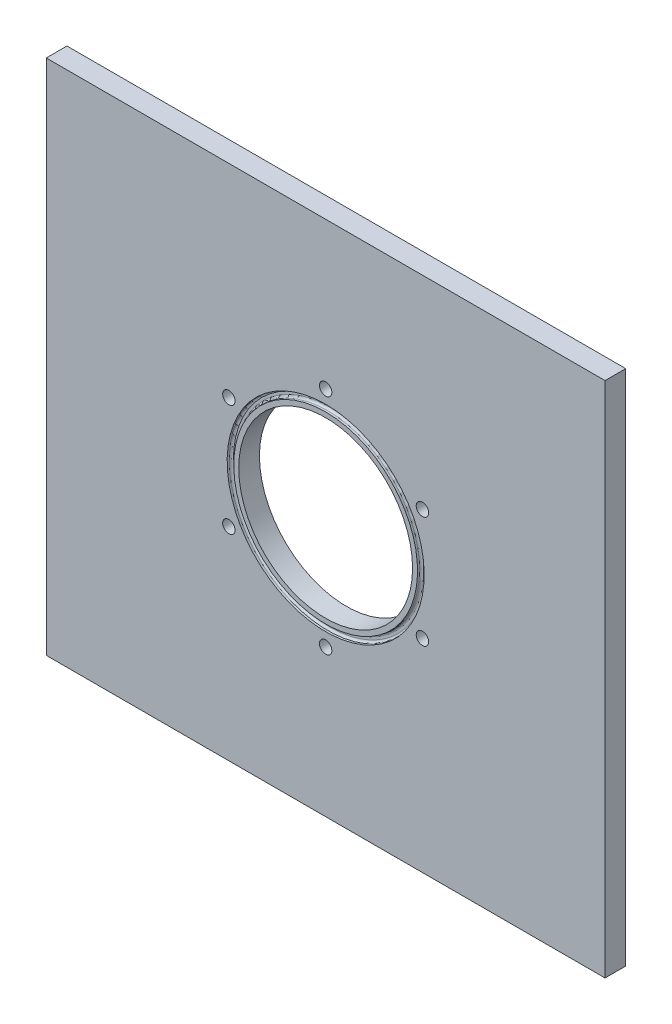
ISO-10303-21;
HEADER;
FILE_DESCRIPTION(('STEP AP214'),'2;1');
FILE_NAME('part.step','',(''),(''),'','','');
FILE_SCHEMA(('AUTOMOTIVE_DESIGN { 1 0 10303 214 1 1 1 1 }'));
ENDSEC;
DATA;
#1=APPLICATION_CONTEXT('core data for automotive mechanical design processes');
#2=APPLICATION_PROTOCOL_DEFINITION('international standard','automotive_design',2000,#1);
#3=PRODUCT_CONTEXT('',#1,'mechanical');
#4=PRODUCT('Part','Part','',(#3));
#5=PRODUCT_RELATED_PRODUCT_CATEGORY('part','',(#4));
#6=PRODUCT_DEFINITION_FORMATION('','',#4);
#7=PRODUCT_DEFINITION_CONTEXT('part definition',#1,'design');
#8=PRODUCT_DEFINITION('design','',#6,#7);
#9=PRODUCT_DEFINITION_SHAPE('','',#8);
#10=(LENGTH_UNIT() NAMED_UNIT(*) SI_UNIT(.MILLI.,.METRE.));
#11=(NAMED_UNIT(*) PLANE_ANGLE_UNIT() SI_UNIT($,.RADIAN.));
#12=(NAMED_UNIT(*) SI_UNIT($,.STERADIAN.) SOLID_ANGLE_UNIT());
#13=UNCERTAINTY_MEASURE_WITH_UNIT(LENGTH_MEASURE(1.E-05),#10,'distance_accuracy_value','');
#14=(GEOMETRIC_REPRESENTATION_CONTEXT(3) GLOBAL_UNCERTAINTY_ASSIGNED_CONTEXT((#13)) GLOBAL_UNIT_ASSIGNED_CONTEXT((#10,
#11,#12)) REPRESENTATION_CONTEXT('',''));
#15=CARTESIAN_POINT('',(0.,0.,0.));
#16=DIRECTION('',(0.,0.,1.));
#17=DIRECTION('',(1.,0.,0.));
#18=AXIS2_PLACEMENT_3D('',#15,#16,#17);
#19=CARTESIAN_POINT('',(0.,0.,5.));
#20=DIRECTION('',(0.,0.,1.));
#21=DIRECTION('',(1.,0.,0.));
#22=AXIS2_PLACEMENT_3D('',#19,#20,#21);
#23=PLANE('',#22);
#24=DIRECTION('',(1.,0.,0.));
#25=VECTOR('',#24,1.);
#26=CARTESIAN_POINT('',(0.,-62.5,5.));
#27=LINE('',#26,#25);
#28=CARTESIAN_POINT('',(-67.5,-62.5,5.));
#29=VERTEX_POINT('',#28);
#30=CARTESIAN_POINT('',(67.5,-62.5,5.));
#31=VERTEX_POINT('',#30);
#32=EDGE_CURVE('E176',#29,#31,#27,.T.);
#33=ORIENTED_EDGE('',*,*,#32,.T.);
#34=DIRECTION('',(0.,1.,0.));
#35=VECTOR('',#34,1.);
#36=CARTESIAN_POINT('',(67.5,0.,5.));
#37=LINE('',#36,#35);
#38=CARTESIAN_POINT('',(67.5,62.5,5.));
#39=VERTEX_POINT('',#38);
#40=EDGE_CURVE('E168',#31,#39,#37,.T.);
#41=ORIENTED_EDGE('',*,*,#40,.T.);
#42=DIRECTION('',(1.,0.,0.));
#43=VECTOR('',#42,1.);
#44=CARTESIAN_POINT('',(0.,62.5,5.));
#45=LINE('',#44,#43);
#46=CARTESIAN_POINT('',(-67.5,62.5,5.));
#47=VERTEX_POINT('',#46);
#48=EDGE_CURVE('E175',#47,#39,#45,.T.);
#49=ORIENTED_EDGE('',*,*,#48,.F.);
#50=DIRECTION('',(0.,1.,0.));
#51=VECTOR('',#50,1.);
#52=CARTESIAN_POINT('',(-67.5,0.,5.));
#53=LINE('',#52,#51);
#54=EDGE_CURVE('E188',#29,#47,#53,.T.);
#55=ORIENTED_EDGE('',*,*,#54,.F.);
#56=EDGE_LOOP('',(#33,#41,#49,#55));
#57=FACE_BOUND('',#56,.T.);
#58=CARTESIAN_POINT('',(-23.3826859021798,-13.5,5.));
#59=DIRECTION('',(0.,0.,1.));
#60=DIRECTION('',(1.,0.,0.));
#61=AXIS2_PLACEMENT_3D('',#58,#59,#60);
#62=CIRCLE('',#61,1.50000000000024);
#63=CARTESIAN_POINT('',(-21.8826859021796,-13.5,5.));
#64=VERTEX_POINT('',#63);
#65=EDGE_CURVE('E232',#64,#64,#62,.T.);
#66=ORIENTED_EDGE('',*,*,#65,.F.);
#67=EDGE_LOOP('',(#66));
#68=FACE_BOUND('',#67,.T.);
#69=CARTESIAN_POINT('',(-23.3826859021799,13.5,5.));
#70=DIRECTION('',(0.,0.,1.));
#71=DIRECTION('',(1.,0.,0.));
#72=AXIS2_PLACEMENT_3D('',#69,#70,#71);
#73=CIRCLE('',#72,1.50000000000032);
#74=CARTESIAN_POINT('',(-21.8826859021795,13.5,5.));
#75=VERTEX_POINT('',#74);
#76=EDGE_CURVE('E236',#75,#75,#73,.T.);
#77=ORIENTED_EDGE('',*,*,#76,.F.);
#78=EDGE_LOOP('',(#77));
#79=FACE_BOUND('',#78,.T.);
#80=CARTESIAN_POINT('',(0.,27.,5.));
#81=DIRECTION('',(0.,0.,1.));
#82=DIRECTION('',(1.,0.,0.));
#83=AXIS2_PLACEMENT_3D('',#80,#81,#82);
#84=CIRCLE('',#83,1.5);
#85=CARTESIAN_POINT('',(1.5,27.,5.));
#86=VERTEX_POINT('',#85);
#87=EDGE_CURVE('E269',#86,#86,#84,.T.);
#88=ORIENTED_EDGE('',*,*,#87,.F.);
#89=EDGE_LOOP('',(#88));
#90=FACE_BOUND('',#89,.T.);
#91=CARTESIAN_POINT('',(23.3826859021798,13.5,5.));
#92=DIRECTION('',(0.,0.,1.));
#93=DIRECTION('',(1.,0.,0.));
#94=AXIS2_PLACEMENT_3D('',#91,#92,#93);
#95=CIRCLE('',#94,1.50000000000008);
#96=CARTESIAN_POINT('',(24.8826859021799,13.5,5.));
#97=VERTEX_POINT('',#96);
#98=EDGE_CURVE('E261',#97,#97,#95,.T.);
#99=ORIENTED_EDGE('',*,*,#98,.F.);
#100=EDGE_LOOP('',(#99));
#101=FACE_BOUND('',#100,.T.);
#102=CARTESIAN_POINT('',(23.3826859021798,-13.5,5.));
#103=DIRECTION('',(0.,0.,1.));
#104=DIRECTION('',(1.,0.,0.));
#105=AXIS2_PLACEMENT_3D('',#102,#103,#104);
#106=CIRCLE('',#105,1.50000000000013);
#107=CARTESIAN_POINT('',(24.88268590218,-13.5,5.));
#108=VERTEX_POINT('',#107);
#109=EDGE_CURVE('E253',#108,#108,#106,.T.);
#110=ORIENTED_EDGE('',*,*,#109,.F.);
#111=EDGE_LOOP('',(#110));
#112=FACE_BOUND('',#111,.T.);
#113=CARTESIAN_POINT('',(0.,-27.,5.));
#114=DIRECTION('',(0.,0.,1.));
#115=DIRECTION('',(1.,0.,0.));
#116=AXIS2_PLACEMENT_3D('',#113,#114,#115);
#117=CIRCLE('',#116,1.50000000000018);
#118=CARTESIAN_POINT('',(1.50000000000019,-27.,5.));
#119=VERTEX_POINT('',#118);
#120=EDGE_CURVE('E244',#119,#119,#117,.T.);
#121=ORIENTED_EDGE('',*,*,#120,.F.);
#122=EDGE_LOOP('',(#121));
#123=FACE_BOUND('',#122,.T.);
#124=CARTESIAN_POINT('',(0.,0.,5.));
#125=DIRECTION('',(0.,0.,-1.));
#126=DIRECTION('',(0.,1.,0.));
#127=AXIS2_PLACEMENT_3D('',#124,#125,#126);
#128=CIRCLE('',#127,23.8);
#129=CARTESIAN_POINT('',(0.,23.8,5.));
#130=VERTEX_POINT('',#129);
#131=EDGE_CURVE('E284',#130,#130,#128,.T.);
#132=ORIENTED_EDGE('',*,*,#131,.T.);
#133=EDGE_LOOP('',(#132));
#134=FACE_BOUND('',#133,.T.);
#135=ADVANCED_FACE('F125',(#57,#68,#79,#90,#101,#112,#123,#134),#23,.T.);
#136=CARTESIAN_POINT('',(0.,0.,5.));
#137=DIRECTION('',(0.,0.,1.));
#138=DIRECTION('',(1.,0.,0.));
#139=AXIS2_PLACEMENT_3D('',#136,#137,#138);
#140=CIRCLE('',#139,21.);
#141=CARTESIAN_POINT('',(21.,0.,5.));
#142=VERTEX_POINT('',#141);
#143=EDGE_CURVE('E212',#142,#142,#140,.T.);
#144=ORIENTED_EDGE('',*,*,#143,.F.);
#145=EDGE_LOOP('',(#144));
#146=FACE_BOUND('',#145,.T.);
#147=CARTESIAN_POINT('',(0.,0.,5.));
#148=DIRECTION('',(0.,0.,-1.));
#149=DIRECTION('',(0.,1.,0.));
#150=AXIS2_PLACEMENT_3D('',#147,#148,#149);
#151=CIRCLE('',#150,22.2);
#152=CARTESIAN_POINT('',(0.,22.2,5.));
#153=VERTEX_POINT('',#152);
#154=EDGE_CURVE('E314',#153,#153,#151,.T.);
#155=ORIENTED_EDGE('',*,*,#154,.F.);
#156=EDGE_LOOP('',(#155));
#157=FACE_BOUND('',#156,.T.);
#158=ADVANCED_FACE('F322',(#146,#157),#23,.T.);
#159=CARTESIAN_POINT('',(67.5,0.,5.));
#160=DIRECTION('',(-1.,0.,0.));
#161=DIRECTION('',(0.,0.,1.));
#162=AXIS2_PLACEMENT_3D('',#159,#160,#161);
#163=PLANE('',#162);
#164=DIRECTION('',(0.,1.,0.));
#165=VECTOR('',#164,1.);
#166=CARTESIAN_POINT('',(67.5,0.,0.));
#167=LINE('',#166,#165);
#168=CARTESIAN_POINT('',(67.5,-62.5,0.));
#169=VERTEX_POINT('',#168);
#170=CARTESIAN_POINT('',(67.5,62.5,0.));
#171=VERTEX_POINT('',#170);
#172=EDGE_CURVE('E182',#169,#171,#167,.T.);
#173=ORIENTED_EDGE('',*,*,#172,.T.);
#174=DIRECTION('',(0.,0.,-1.));
#175=VECTOR('',#174,1.);
#176=CARTESIAN_POINT('',(67.5,62.5,5.));
#177=LINE('',#176,#175);
#178=EDGE_CURVE('E135',#39,#171,#177,.T.);
#179=ORIENTED_EDGE('',*,*,#178,.F.);
#180=ORIENTED_EDGE('',*,*,#40,.F.);
#181=DIRECTION('',(0.,0.,-1.));
#182=VECTOR('',#181,1.);
#183=CARTESIAN_POINT('',(67.5,-62.5,5.));
#184=LINE('',#183,#182);
#185=EDGE_CURVE('E12',#31,#169,#184,.T.);
#186=ORIENTED_EDGE('',*,*,#185,.T.);
#187=EDGE_LOOP('',(#173,#179,#180,#186));
#188=FACE_BOUND('',#187,.T.);
#189=ADVANCED_FACE('F181',(#188),#163,.F.);
#190=CARTESIAN_POINT('',(0.,62.5,5.));
#191=DIRECTION('',(0.,1.,0.));
#192=DIRECTION('',(0.,0.,1.));
#193=AXIS2_PLACEMENT_3D('',#190,#191,#192);
#194=PLANE('',#193);
#195=DIRECTION('',(1.,0.,0.));
#196=VECTOR('',#195,1.);
#197=CARTESIAN_POINT('',(0.,62.5,0.));
#198=LINE('',#197,#196);
#199=CARTESIAN_POINT('',(-67.5,62.5,0.));
#200=VERTEX_POINT('',#199);
#201=EDGE_CURVE('E205',#200,#171,#198,.T.);
#202=ORIENTED_EDGE('',*,*,#201,.F.);
#203=DIRECTION('',(0.,0.,-1.));
#204=VECTOR('',#203,1.);
#205=CARTESIAN_POINT('',(-67.5,62.5,5.));
#206=LINE('',#205,#204);
#207=EDGE_CURVE('E157',#47,#200,#206,.T.);
#208=ORIENTED_EDGE('',*,*,#207,.F.);
#209=ORIENTED_EDGE('',*,*,#48,.T.);
#210=ORIENTED_EDGE('',*,*,#178,.T.);
#211=EDGE_LOOP('',(#202,#208,#209,#210));
#212=FACE_BOUND('',#211,.T.);
#213=ADVANCED_FACE('F186',(#212),#194,.T.);
#214=CARTESIAN_POINT('',(-67.5,0.,5.));
#215=DIRECTION('',(-1.,0.,0.));
#216=DIRECTION('',(0.,0.,1.));
#217=AXIS2_PLACEMENT_3D('',#214,#215,#216);
#218=PLANE('',#217);
#219=DIRECTION('',(0.,1.,0.));
#220=VECTOR('',#219,1.);
#221=CARTESIAN_POINT('',(-67.5,0.,0.));
#222=LINE('',#221,#220);
#223=CARTESIAN_POINT('',(-67.5,-62.5,0.));
#224=VERTEX_POINT('',#223);
#225=EDGE_CURVE('E208',#224,#200,#222,.T.);
#226=ORIENTED_EDGE('',*,*,#225,.F.);
#227=DIRECTION('',(0.,0.,-1.));
#228=VECTOR('',#227,1.);
#229=CARTESIAN_POINT('',(-67.5,-62.5,5.));
#230=LINE('',#229,#228);
#231=EDGE_CURVE('E143',#29,#224,#230,.T.);
#232=ORIENTED_EDGE('',*,*,#231,.F.);
#233=ORIENTED_EDGE('',*,*,#54,.T.);
#234=ORIENTED_EDGE('',*,*,#207,.T.);
#235=EDGE_LOOP('',(#226,#232,#233,#234));
#236=FACE_BOUND('',#235,.T.);
#237=ADVANCED_FACE('F340',(#236),#218,.T.);
#238=CARTESIAN_POINT('',(0.,-62.5,5.));
#239=DIRECTION('',(0.,1.,0.));
#240=DIRECTION('',(0.,0.,1.));
#241=AXIS2_PLACEMENT_3D('',#238,#239,#240);
#242=PLANE('',#241);
#243=DIRECTION('',(1.,0.,0.));
#244=VECTOR('',#243,1.);
#245=CARTESIAN_POINT('',(0.,-62.5,0.));
#246=LINE('',#245,#244);
#247=EDGE_CURVE('E199',#224,#169,#246,.T.);
#248=ORIENTED_EDGE('',*,*,#247,.T.);
#249=ORIENTED_EDGE('',*,*,#185,.F.);
#250=ORIENTED_EDGE('',*,*,#32,.F.);
#251=ORIENTED_EDGE('',*,*,#231,.T.);
#252=EDGE_LOOP('',(#248,#249,#250,#251));
#253=FACE_BOUND('',#252,.T.);
#254=ADVANCED_FACE('F343',(#253),#242,.F.);
#255=CARTESIAN_POINT('',(0.,0.,5.));
#256=DIRECTION('',(0.,0.,-1.));
#257=DIRECTION('',(-1.,0.,0.));
#258=AXIS2_PLACEMENT_3D('',#255,#256,#257);
#259=CYLINDRICAL_SURFACE('',#258,21.);
#260=ORIENTED_EDGE('',*,*,#143,.T.);
#261=EDGE_LOOP('',(#260));
#262=FACE_BOUND('',#261,.T.);
#263=CARTESIAN_POINT('',(0.,0.,0.));
#264=DIRECTION('',(0.,0.,1.));
#265=DIRECTION('',(1.,0.,0.));
#266=AXIS2_PLACEMENT_3D('',#263,#264,#265);
#267=CIRCLE('',#266,21.);
#268=CARTESIAN_POINT('',(21.,0.,0.));
#269=VERTEX_POINT('',#268);
#270=EDGE_CURVE('E195',#269,#269,#267,.T.);
#271=ORIENTED_EDGE('',*,*,#270,.F.);
#272=EDGE_LOOP('',(#271));
#273=FACE_BOUND('',#272,.T.);
#274=ADVANCED_FACE('F127',(#262,#273),#259,.F.);
#275=CARTESIAN_POINT('',(0.,0.,0.));
#276=DIRECTION('',(0.,0.,1.));
#277=DIRECTION('',(1.,0.,0.));
#278=AXIS2_PLACEMENT_3D('',#275,#276,#277);
#279=PLANE('',#278);
#280=CARTESIAN_POINT('',(-27.,0.,0.));
#281=DIRECTION('',(0.,0.,-1.));
#282=DIRECTION('',(-1.,0.,0.));
#283=AXIS2_PLACEMENT_3D('',#280,#281,#282);
#284=CIRCLE('',#283,1.5);
#285=CARTESIAN_POINT('',(-28.5,0.,0.));
#286=VERTEX_POINT('',#285);
#287=EDGE_CURVE('E288',#286,#286,#284,.T.);
#288=ORIENTED_EDGE('',*,*,#287,.F.);
#289=EDGE_LOOP('',(#288));
#290=FACE_BOUND('',#289,.T.);
#291=CARTESIAN_POINT('',(27.,0.,0.));
#292=DIRECTION('',(0.,0.,-1.));
#293=DIRECTION('',(-1.,0.,0.));
#294=AXIS2_PLACEMENT_3D('',#291,#292,#293);
#295=CIRCLE('',#294,1.5);
#296=CARTESIAN_POINT('',(25.5,0.,0.));
#297=VERTEX_POINT('',#296);
#298=EDGE_CURVE('E283',#297,#297,#295,.T.);
#299=ORIENTED_EDGE('',*,*,#298,.F.);
#300=EDGE_LOOP('',(#299));
#301=FACE_BOUND('',#300,.T.);
#302=ORIENTED_EDGE('',*,*,#270,.T.);
#303=EDGE_LOOP('',(#302));
#304=FACE_BOUND('',#303,.T.);
#305=ORIENTED_EDGE('',*,*,#247,.F.);
#306=ORIENTED_EDGE('',*,*,#225,.T.);
#307=ORIENTED_EDGE('',*,*,#201,.T.);
#308=ORIENTED_EDGE('',*,*,#172,.F.);
#309=EDGE_LOOP('',(#305,#306,#307,#308));
#310=FACE_BOUND('',#309,.T.);
#311=ADVANCED_FACE('F336',(#290,#301,#304,#310),#279,.F.);
#312=CARTESIAN_POINT('',(-23.3826859021798,-13.5,2.));
#313=DIRECTION('',(0.,0.,1.));
#314=DIRECTION('',(1.,0.,0.));
#315=AXIS2_PLACEMENT_3D('',#312,#313,#314);
#316=CYLINDRICAL_SURFACE('',#315,1.50000000000024);
#317=CARTESIAN_POINT('',(-23.3826859021798,-13.5,2.));
#318=DIRECTION('',(0.,0.,1.));
#319=DIRECTION('',(1.,0.,0.));
#320=AXIS2_PLACEMENT_3D('',#317,#318,#319);
#321=CIRCLE('',#320,1.50000000000024);
#322=CARTESIAN_POINT('',(-21.8826859021796,-13.5,2.));
#323=VERTEX_POINT('',#322);
#324=EDGE_CURVE('E200',#323,#323,#321,.T.);
#325=ORIENTED_EDGE('',*,*,#324,.F.);
#326=EDGE_LOOP('',(#325));
#327=FACE_BOUND('',#326,.T.);
#328=ORIENTED_EDGE('',*,*,#65,.T.);
#329=EDGE_LOOP('',(#328));
#330=FACE_BOUND('',#329,.T.);
#331=ADVANCED_FACE('F334',(#327,#330),#316,.F.);
#332=CARTESIAN_POINT('',(-23.3826859021798,-13.5,2.));
#333=DIRECTION('',(0.,0.,1.));
#334=DIRECTION('',(1.,0.,0.));
#335=AXIS2_PLACEMENT_3D('',#332,#333,#334);
#336=PLANE('',#335);
#337=ORIENTED_EDGE('',*,*,#324,.T.);
#338=EDGE_LOOP('',(#337));
#339=FACE_BOUND('',#338,.T.);
#340=ADVANCED_FACE('F408',(#339),#336,.T.);
#341=CARTESIAN_POINT('',(-23.3826859021799,13.5,2.));
#342=DIRECTION('',(0.,0.,1.));
#343=DIRECTION('',(1.,0.,0.));
#344=AXIS2_PLACEMENT_3D('',#341,#342,#343);
#345=CYLINDRICAL_SURFACE('',#344,1.50000000000032);
#346=CARTESIAN_POINT('',(-23.3826859021799,13.5,2.));
#347=DIRECTION('',(0.,0.,1.));
#348=DIRECTION('',(1.,0.,0.));
#349=AXIS2_PLACEMENT_3D('',#346,#347,#348);
#350=CIRCLE('',#349,1.50000000000032);
#351=CARTESIAN_POINT('',(-21.8826859021795,13.5,2.));
#352=VERTEX_POINT('',#351);
#353=EDGE_CURVE('E273',#352,#352,#350,.T.);
#354=ORIENTED_EDGE('',*,*,#353,.F.);
#355=EDGE_LOOP('',(#354));
#356=FACE_BOUND('',#355,.T.);
#357=ORIENTED_EDGE('',*,*,#76,.T.);
#358=EDGE_LOOP('',(#357));
#359=FACE_BOUND('',#358,.T.);
#360=ADVANCED_FACE('F418',(#356,#359),#345,.F.);
#361=CARTESIAN_POINT('',(-23.3826859021799,13.5,2.));
#362=DIRECTION('',(0.,0.,1.));
#363=DIRECTION('',(1.,0.,0.));
#364=AXIS2_PLACEMENT_3D('',#361,#362,#363);
#365=PLANE('',#364);
#366=ORIENTED_EDGE('',*,*,#353,.T.);
#367=EDGE_LOOP('',(#366));
#368=FACE_BOUND('',#367,.T.);
#369=ADVANCED_FACE('F428',(#368),#365,.T.);
#370=CARTESIAN_POINT('',(0.,27.,2.));
#371=DIRECTION('',(0.,0.,1.));
#372=DIRECTION('',(1.,0.,0.));
#373=AXIS2_PLACEMENT_3D('',#370,#371,#372);
#374=CYLINDRICAL_SURFACE('',#373,1.5);
#375=CARTESIAN_POINT('',(0.,27.,2.));
#376=DIRECTION('',(0.,0.,1.));
#377=DIRECTION('',(1.,0.,0.));
#378=AXIS2_PLACEMENT_3D('',#375,#376,#377);
#379=CIRCLE('',#378,1.5);
#380=CARTESIAN_POINT('',(1.5,27.,2.));
#381=VERTEX_POINT('',#380);
#382=EDGE_CURVE('E265',#381,#381,#379,.T.);
#383=ORIENTED_EDGE('',*,*,#382,.F.);
#384=EDGE_LOOP('',(#383));
#385=FACE_BOUND('',#384,.T.);
#386=ORIENTED_EDGE('',*,*,#87,.T.);
#387=EDGE_LOOP('',(#386));
#388=FACE_BOUND('',#387,.T.);
#389=ADVANCED_FACE('F439',(#385,#388),#374,.F.);
#390=CARTESIAN_POINT('',(0.,27.,2.));
#391=DIRECTION('',(0.,0.,1.));
#392=DIRECTION('',(1.,0.,0.));
#393=AXIS2_PLACEMENT_3D('',#390,#391,#392);
#394=PLANE('',#393);
#395=ORIENTED_EDGE('',*,*,#382,.T.);
#396=EDGE_LOOP('',(#395));
#397=FACE_BOUND('',#396,.T.);
#398=ADVANCED_FACE('F450',(#397),#394,.T.);
#399=CARTESIAN_POINT('',(23.3826859021798,13.5,2.));
#400=DIRECTION('',(0.,0.,1.));
#401=DIRECTION('',(1.,0.,0.));
#402=AXIS2_PLACEMENT_3D('',#399,#400,#401);
#403=CYLINDRICAL_SURFACE('',#402,1.50000000000008);
#404=CARTESIAN_POINT('',(23.3826859021798,13.5,2.));
#405=DIRECTION('',(0.,0.,1.));
#406=DIRECTION('',(1.,0.,0.));
#407=AXIS2_PLACEMENT_3D('',#404,#405,#406);
#408=CIRCLE('',#407,1.50000000000008);
#409=CARTESIAN_POINT('',(24.8826859021799,13.5,2.));
#410=VERTEX_POINT('',#409);
#411=EDGE_CURVE('E257',#410,#410,#408,.T.);
#412=ORIENTED_EDGE('',*,*,#411,.F.);
#413=EDGE_LOOP('',(#412));
#414=FACE_BOUND('',#413,.T.);
#415=ORIENTED_EDGE('',*,*,#98,.T.);
#416=EDGE_LOOP('',(#415));
#417=FACE_BOUND('',#416,.T.);
#418=ADVANCED_FACE('F461',(#414,#417),#403,.F.);
#419=CARTESIAN_POINT('',(23.3826859021798,13.5,2.));
#420=DIRECTION('',(0.,0.,1.));
#421=DIRECTION('',(1.,0.,0.));
#422=AXIS2_PLACEMENT_3D('',#419,#420,#421);
#423=PLANE('',#422);
#424=ORIENTED_EDGE('',*,*,#411,.T.);
#425=EDGE_LOOP('',(#424));
#426=FACE_BOUND('',#425,.T.);
#427=ADVANCED_FACE('F472',(#426),#423,.T.);
#428=CARTESIAN_POINT('',(23.3826859021798,-13.5,2.));
#429=DIRECTION('',(0.,0.,1.));
#430=DIRECTION('',(1.,0.,0.));
#431=AXIS2_PLACEMENT_3D('',#428,#429,#430);
#432=CYLINDRICAL_SURFACE('',#431,1.50000000000013);
#433=CARTESIAN_POINT('',(23.3826859021798,-13.5,2.));
#434=DIRECTION('',(0.,0.,1.));
#435=DIRECTION('',(1.,0.,0.));
#436=AXIS2_PLACEMENT_3D('',#433,#434,#435);
#437=CIRCLE('',#436,1.50000000000013);
#438=CARTESIAN_POINT('',(24.88268590218,-13.5,2.));
#439=VERTEX_POINT('',#438);
#440=EDGE_CURVE('E249',#439,#439,#437,.T.);
#441=ORIENTED_EDGE('',*,*,#440,.F.);
#442=EDGE_LOOP('',(#441));
#443=FACE_BOUND('',#442,.T.);
#444=ORIENTED_EDGE('',*,*,#109,.T.);
#445=EDGE_LOOP('',(#444));
#446=FACE_BOUND('',#445,.T.);
#447=ADVANCED_FACE('F483',(#443,#446),#432,.F.);
#448=CARTESIAN_POINT('',(23.3826859021798,-13.5,2.));
#449=DIRECTION('',(0.,0.,1.));
#450=DIRECTION('',(1.,0.,0.));
#451=AXIS2_PLACEMENT_3D('',#448,#449,#450);
#452=PLANE('',#451);
#453=ORIENTED_EDGE('',*,*,#440,.T.);
#454=EDGE_LOOP('',(#453));
#455=FACE_BOUND('',#454,.T.);
#456=ADVANCED_FACE('F494',(#455),#452,.T.);
#457=CARTESIAN_POINT('',(0.,-27.,2.));
#458=DIRECTION('',(0.,0.,1.));
#459=DIRECTION('',(1.,0.,0.));
#460=AXIS2_PLACEMENT_3D('',#457,#458,#459);
#461=CYLINDRICAL_SURFACE('',#460,1.50000000000018);
#462=CARTESIAN_POINT('',(0.,-27.,2.));
#463=DIRECTION('',(0.,0.,1.));
#464=DIRECTION('',(1.,0.,0.));
#465=AXIS2_PLACEMENT_3D('',#462,#463,#464);
#466=CIRCLE('',#465,1.50000000000018);
#467=CARTESIAN_POINT('',(1.50000000000019,-27.,2.));
#468=VERTEX_POINT('',#467);
#469=EDGE_CURVE('E240',#468,#468,#466,.T.);
#470=ORIENTED_EDGE('',*,*,#469,.F.);
#471=EDGE_LOOP('',(#470));
#472=FACE_BOUND('',#471,.T.);
#473=ORIENTED_EDGE('',*,*,#120,.T.);
#474=EDGE_LOOP('',(#473));
#475=FACE_BOUND('',#474,.T.);
#476=ADVANCED_FACE('F505',(#472,#475),#461,.F.);
#477=CARTESIAN_POINT('',(0.,-27.,2.));
#478=DIRECTION('',(0.,0.,1.));
#479=DIRECTION('',(1.,0.,0.));
#480=AXIS2_PLACEMENT_3D('',#477,#478,#479);
#481=PLANE('',#480);
#482=ORIENTED_EDGE('',*,*,#469,.T.);
#483=EDGE_LOOP('',(#482));
#484=FACE_BOUND('',#483,.T.);
#485=ADVANCED_FACE('F516',(#484),#481,.T.);
#486=CARTESIAN_POINT('',(27.,0.,3.));
#487=DIRECTION('',(0.,0.,-1.));
#488=DIRECTION('',(-1.,0.,0.));
#489=AXIS2_PLACEMENT_3D('',#486,#487,#488);
#490=CYLINDRICAL_SURFACE('',#489,1.5);
#491=CARTESIAN_POINT('',(27.,0.,3.));
#492=DIRECTION('',(0.,0.,-1.));
#493=DIRECTION('',(-1.,0.,0.));
#494=AXIS2_PLACEMENT_3D('',#491,#492,#493);
#495=CIRCLE('',#494,1.5);
#496=CARTESIAN_POINT('',(25.5,0.,3.));
#497=VERTEX_POINT('',#496);
#498=EDGE_CURVE('E279',#497,#497,#495,.T.);
#499=ORIENTED_EDGE('',*,*,#498,.F.);
#500=EDGE_LOOP('',(#499));
#501=FACE_BOUND('',#500,.T.);
#502=ORIENTED_EDGE('',*,*,#298,.T.);
#503=EDGE_LOOP('',(#502));
#504=FACE_BOUND('',#503,.T.);
#505=ADVANCED_FACE('F526',(#501,#504),#490,.F.);
#506=CARTESIAN_POINT('',(27.,0.,3.));
#507=DIRECTION('',(0.,0.,-1.));
#508=DIRECTION('',(-1.,0.,0.));
#509=AXIS2_PLACEMENT_3D('',#506,#507,#508);
#510=PLANE('',#509);
#511=ORIENTED_EDGE('',*,*,#498,.T.);
#512=EDGE_LOOP('',(#511));
#513=FACE_BOUND('',#512,.T.);
#514=ADVANCED_FACE('F536',(#513),#510,.T.);
#515=CARTESIAN_POINT('',(-27.,0.,3.));
#516=DIRECTION('',(0.,0.,-1.));
#517=DIRECTION('',(-1.,0.,0.));
#518=AXIS2_PLACEMENT_3D('',#515,#516,#517);
#519=CYLINDRICAL_SURFACE('',#518,1.5);
#520=CARTESIAN_POINT('',(-27.,0.,3.));
#521=DIRECTION('',(0.,0.,-1.));
#522=DIRECTION('',(-1.,0.,0.));
#523=AXIS2_PLACEMENT_3D('',#520,#521,#522);
#524=CIRCLE('',#523,1.5);
#525=CARTESIAN_POINT('',(-28.5,0.,3.));
#526=VERTEX_POINT('',#525);
#527=EDGE_CURVE('E245',#526,#526,#524,.T.);
#528=ORIENTED_EDGE('',*,*,#527,.F.);
#529=EDGE_LOOP('',(#528));
#530=FACE_BOUND('',#529,.T.);
#531=ORIENTED_EDGE('',*,*,#287,.T.);
#532=EDGE_LOOP('',(#531));
#533=FACE_BOUND('',#532,.T.);
#534=ADVANCED_FACE('F547',(#530,#533),#519,.F.);
#535=CARTESIAN_POINT('',(-27.,0.,3.));
#536=DIRECTION('',(0.,0.,-1.));
#537=DIRECTION('',(-1.,0.,0.));
#538=AXIS2_PLACEMENT_3D('',#535,#536,#537);
#539=PLANE('',#538);
#540=ORIENTED_EDGE('',*,*,#527,.T.);
#541=EDGE_LOOP('',(#540));
#542=FACE_BOUND('',#541,.T.);
#543=ADVANCED_FACE('F558',(#542),#539,.T.);
#544=CARTESIAN_POINT('',(0.,0.,0.));
#545=DIRECTION('',(0.,0.,-1.));
#546=DIRECTION('',(0.,1.,0.));
#547=AXIS2_PLACEMENT_3D('',#544,#545,#546);
#548=CYLINDRICAL_SURFACE('',#547,23.8);
#549=ORIENTED_EDGE('',*,*,#131,.F.);
#550=EDGE_LOOP('',(#549));
#551=FACE_BOUND('',#550,.T.);
#552=CARTESIAN_POINT('',(0.,0.,4.5));
#553=DIRECTION('',(0.,0.,-1.));
#554=DIRECTION('',(0.,1.,0.));
#555=AXIS2_PLACEMENT_3D('',#552,#553,#554);
#556=CIRCLE('',#555,23.8);
#557=CARTESIAN_POINT('',(0.,23.8,4.5));
#558=VERTEX_POINT('',#557);
#559=EDGE_CURVE('E298',#558,#558,#556,.T.);
#560=ORIENTED_EDGE('',*,*,#559,.T.);
#561=EDGE_LOOP('',(#560));
#562=FACE_BOUND('',#561,.T.);
#563=ADVANCED_FACE('F569',(#551,#562),#548,.F.);
#564=CARTESIAN_POINT('',(0.,0.,4.5));
#565=DIRECTION('',(0.,0.,-1.));
#566=DIRECTION('',(0.,1.,0.));
#567=AXIS2_PLACEMENT_3D('',#564,#565,#566);
#568=TOROIDAL_SURFACE('',#567,23.3,0.500000000000002);
#569=ORIENTED_EDGE('',*,*,#559,.F.);
#570=EDGE_LOOP('',(#569));
#571=FACE_BOUND('',#570,.T.);
#572=CARTESIAN_POINT('',(0.,0.,4.));
#573=DIRECTION('',(0.,0.,-1.));
#574=DIRECTION('',(0.,1.,0.));
#575=AXIS2_PLACEMENT_3D('',#572,#573,#574);
#576=CIRCLE('',#575,23.3);
#577=CARTESIAN_POINT('',(0.,23.3,4.));
#578=VERTEX_POINT('',#577);
#579=EDGE_CURVE('E302',#578,#578,#576,.T.);
#580=ORIENTED_EDGE('',*,*,#579,.T.);
#581=EDGE_LOOP('',(#580));
#582=FACE_BOUND('',#581,.T.);
#583=ADVANCED_FACE('F591',(#571,#582),#568,.F.);
#584=CARTESIAN_POINT('',(0.,23.3,4.));
#585=DIRECTION('',(0.,0.,-1.));
#586=DIRECTION('',(0.,1.,0.));
#587=AXIS2_PLACEMENT_3D('',#584,#585,#586);
#588=PLANE('',#587);
#589=ORIENTED_EDGE('',*,*,#579,.F.);
#590=EDGE_LOOP('',(#589));
#591=FACE_BOUND('',#590,.T.);
#592=CARTESIAN_POINT('',(0.,0.,4.));
#593=DIRECTION('',(0.,0.,-1.));
#594=DIRECTION('',(0.,1.,0.));
#595=AXIS2_PLACEMENT_3D('',#592,#593,#594);
#596=CIRCLE('',#595,22.7);
#597=CARTESIAN_POINT('',(0.,22.7,4.));
#598=VERTEX_POINT('',#597);
#599=EDGE_CURVE('E306',#598,#598,#596,.T.);
#600=ORIENTED_EDGE('',*,*,#599,.T.);
#601=EDGE_LOOP('',(#600));
#602=FACE_BOUND('',#601,.T.);
#603=ADVANCED_FACE('F602',(#591,#602),#588,.F.);
#604=CARTESIAN_POINT('',(0.,0.,4.5));
#605=DIRECTION('',(0.,0.,-1.));
#606=DIRECTION('',(0.,1.,0.));
#607=AXIS2_PLACEMENT_3D('',#604,#605,#606);
#608=TOROIDAL_SURFACE('',#607,22.7,0.500000000000002);
#609=ORIENTED_EDGE('',*,*,#599,.F.);
#610=EDGE_LOOP('',(#609));
#611=FACE_BOUND('',#610,.T.);
#612=CARTESIAN_POINT('',(0.,0.,4.5));
#613=DIRECTION('',(0.,0.,-1.));
#614=DIRECTION('',(0.,1.,0.));
#615=AXIS2_PLACEMENT_3D('',#612,#613,#614);
#616=CIRCLE('',#615,22.2);
#617=CARTESIAN_POINT('',(0.,22.2,4.5));
#618=VERTEX_POINT('',#617);
#619=EDGE_CURVE('E310',#618,#618,#616,.T.);
#620=ORIENTED_EDGE('',*,*,#619,.T.);
#621=EDGE_LOOP('',(#620));
#622=FACE_BOUND('',#621,.T.);
#623=ADVANCED_FACE('F613',(#611,#622),#608,.F.);
#624=CARTESIAN_POINT('',(0.,0.,0.));
#625=DIRECTION('',(0.,0.,-1.));
#626=DIRECTION('',(0.,1.,0.));
#627=AXIS2_PLACEMENT_3D('',#624,#625,#626);
#628=CYLINDRICAL_SURFACE('',#627,22.2);
#629=ORIENTED_EDGE('',*,*,#619,.F.);
#630=EDGE_LOOP('',(#629));
#631=FACE_BOUND('',#630,.T.);
#632=ORIENTED_EDGE('',*,*,#154,.T.);
#633=EDGE_LOOP('',(#632));
#634=FACE_BOUND('',#633,.T.);
#635=ADVANCED_FACE('F320',(#631,#634),#628,.T.);
#636=CLOSED_SHELL('',(#135,#158,#189,#213,#237,#254,#274,#311,#331,#340,#360,#369,#389,#398,
#418,#427,#447,#456,#476,#485,#505,#514,#534,#543,#563,#583,#603,#623,#635));
#637=MANIFOLD_SOLID_BREP('B2',#636);
#638=ADVANCED_BREP_SHAPE_REPRESENTATION('',(#18,#637),#14);
#639=SHAPE_DEFINITION_REPRESENTATION(#9,#638);
ENDSEC;
END-ISO-10303-21;
